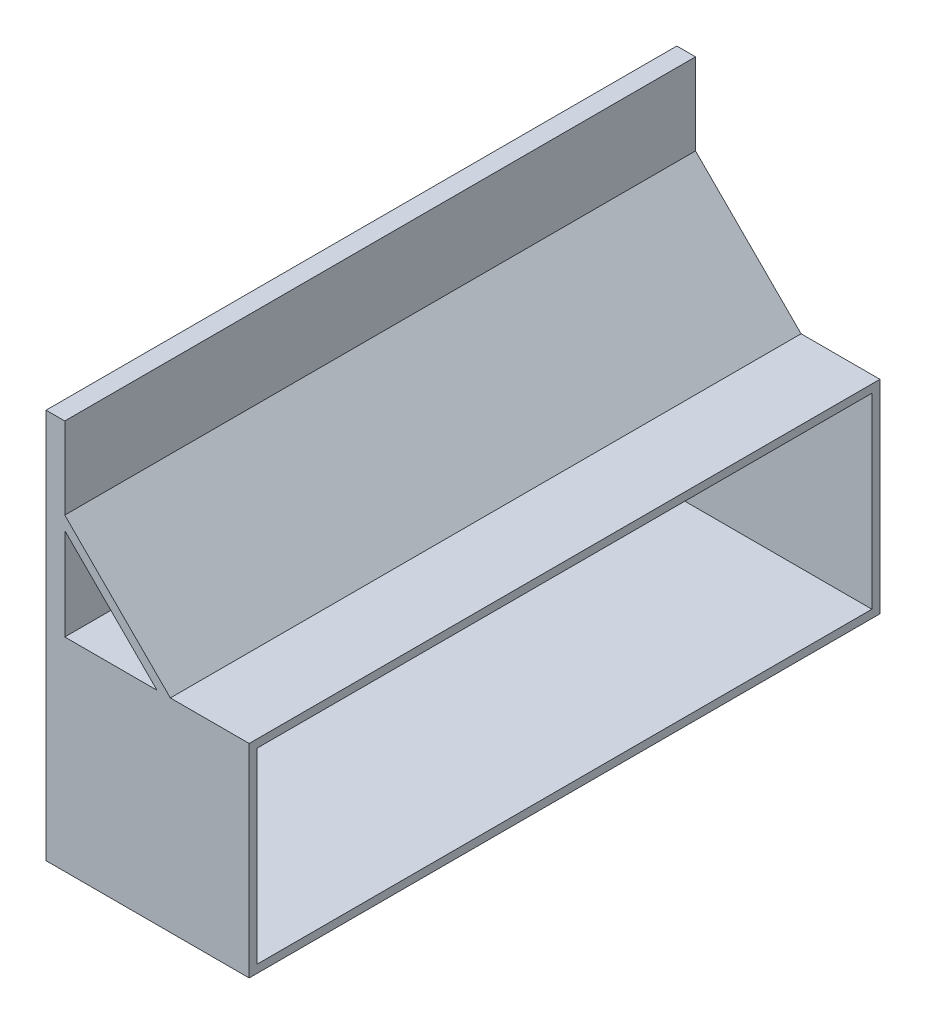
ISO-10303-21;
HEADER;
FILE_DESCRIPTION(('STEP AP214'),'2;1');
FILE_NAME('part.step','',(''),(''),'','','');
FILE_SCHEMA(('AUTOMOTIVE_DESIGN { 1 0 10303 214 1 1 1 1 }'));
ENDSEC;
DATA;
#1=APPLICATION_CONTEXT('core data for automotive mechanical design processes');
#2=APPLICATION_PROTOCOL_DEFINITION('international standard','automotive_design',2000,#1);
#3=PRODUCT_CONTEXT('',#1,'mechanical');
#4=PRODUCT('Part','Part','',(#3));
#5=PRODUCT_RELATED_PRODUCT_CATEGORY('part','',(#4));
#6=PRODUCT_DEFINITION_FORMATION('','',#4);
#7=PRODUCT_DEFINITION_CONTEXT('part definition',#1,'design');
#8=PRODUCT_DEFINITION('design','',#6,#7);
#9=PRODUCT_DEFINITION_SHAPE('','',#8);
#10=(LENGTH_UNIT() NAMED_UNIT(*) SI_UNIT(.MILLI.,.METRE.));
#11=(NAMED_UNIT(*) PLANE_ANGLE_UNIT() SI_UNIT($,.RADIAN.));
#12=(NAMED_UNIT(*) SI_UNIT($,.STERADIAN.) SOLID_ANGLE_UNIT());
#13=UNCERTAINTY_MEASURE_WITH_UNIT(LENGTH_MEASURE(1.E-05),#10,'distance_accuracy_value','');
#14=(GEOMETRIC_REPRESENTATION_CONTEXT(3) GLOBAL_UNCERTAINTY_ASSIGNED_CONTEXT((#13)) GLOBAL_UNIT_ASSIGNED_CONTEXT((#10,
#11,#12)) REPRESENTATION_CONTEXT('',''));
#15=CARTESIAN_POINT('',(0.,0.,0.));
#16=DIRECTION('',(0.,0.,1.));
#17=DIRECTION('',(1.,0.,0.));
#18=AXIS2_PLACEMENT_3D('',#15,#16,#17);
#19=CARTESIAN_POINT('',(-46.8916083916084,29.1083916083916,236.));
#20=DIRECTION('',(0.,-1.,0.));
#21=DIRECTION('',(0.,0.,-1.));
#22=AXIS2_PLACEMENT_3D('',#19,#20,#21);
#23=PLANE('',#22);
#24=DIRECTION('',(-1.,0.,0.));
#25=VECTOR('',#24,1.);
#26=CARTESIAN_POINT('',(-46.8916083916084,29.1083916083916,0.));
#27=LINE('',#26,#25);
#28=CARTESIAN_POINT('',(29.1083916083916,29.1083916083916,0.));
#29=VERTEX_POINT('',#28);
#30=CARTESIAN_POINT('',(-0.391608391608358,29.1083916083916,0.));
#31=VERTEX_POINT('',#30);
#32=EDGE_CURVE('E145',#29,#31,#27,.T.);
#33=ORIENTED_EDGE('',*,*,#32,.T.);
#34=DIRECTION('',(0.,0.,1.));
#35=VECTOR('',#34,1.);
#36=CARTESIAN_POINT('',(-0.391608391608357,29.1083916083916,0.));
#37=LINE('',#36,#35);
#38=CARTESIAN_POINT('',(-0.391608391608358,29.1083916083916,236.));
#39=VERTEX_POINT('',#38);
#40=EDGE_CURVE('E60',#31,#39,#37,.T.);
#41=ORIENTED_EDGE('',*,*,#40,.T.);
#42=DIRECTION('',(-1.,0.,0.));
#43=VECTOR('',#42,1.);
#44=CARTESIAN_POINT('',(-46.8916083916084,29.1083916083916,236.));
#45=LINE('',#44,#43);
#46=CARTESIAN_POINT('',(29.1083916083916,29.1083916083916,236.));
#47=VERTEX_POINT('',#46);
#48=EDGE_CURVE('E220',#47,#39,#45,.T.);
#49=ORIENTED_EDGE('',*,*,#48,.F.);
#50=DIRECTION('',(0.,0.,-1.));
#51=VECTOR('',#50,1.);
#52=CARTESIAN_POINT('',(29.1083916083916,29.1083916083916,236.));
#53=LINE('',#52,#51);
#54=EDGE_CURVE('E222',#47,#29,#53,.T.);
#55=ORIENTED_EDGE('',*,*,#54,.T.);
#56=EDGE_LOOP('',(#33,#41,#49,#55));
#57=FACE_BOUND('',#56,.T.);
#58=ADVANCED_FACE('F37',(#57),#23,.F.);
#59=CARTESIAN_POINT('',(-39.8916083916084,99.1083916083916,0.));
#60=DIRECTION('',(-1.,0.,0.));
#61=DIRECTION('',(0.,0.,1.));
#62=AXIS2_PLACEMENT_3D('',#59,#60,#61);
#63=PLANE('',#62);
#64=DIRECTION('',(0.,-1.,0.));
#65=VECTOR('',#64,1.);
#66=CARTESIAN_POINT('',(-39.8916083916083,99.1083916083916,236.));
#67=LINE('',#66,#65);
#68=CARTESIAN_POINT('',(-39.8916083916083,99.1083916083916,236.));
#69=VERTEX_POINT('',#68);
#70=CARTESIAN_POINT('',(-39.8916083916083,68.6083916083916,236.));
#71=VERTEX_POINT('',#70);
#72=EDGE_CURVE('E189',#69,#71,#67,.T.);
#73=ORIENTED_EDGE('',*,*,#72,.T.);
#74=DIRECTION('',(0.,0.,1.));
#75=VECTOR('',#74,1.);
#76=CARTESIAN_POINT('',(-39.8916083916083,68.6083916083916,0.));
#77=LINE('',#76,#75);
#78=CARTESIAN_POINT('',(-39.8916083916084,68.6083916083916,0.));
#79=VERTEX_POINT('',#78);
#80=EDGE_CURVE('E168',#79,#71,#77,.T.);
#81=ORIENTED_EDGE('',*,*,#80,.F.);
#82=DIRECTION('',(0.,-1.,0.));
#83=VECTOR('',#82,1.);
#84=CARTESIAN_POINT('',(-39.8916083916084,99.1083916083916,0.));
#85=LINE('',#84,#83);
#86=CARTESIAN_POINT('',(-39.8916083916084,99.1083916083916,0.));
#87=VERTEX_POINT('',#86);
#88=EDGE_CURVE('E185',#87,#79,#85,.T.);
#89=ORIENTED_EDGE('',*,*,#88,.F.);
#90=DIRECTION('',(0.,0.,-1.));
#91=VECTOR('',#90,1.);
#92=CARTESIAN_POINT('',(-39.8916083916084,99.1083916083916,0.));
#93=LINE('',#92,#91);
#94=EDGE_CURVE('E179',#69,#87,#93,.T.);
#95=ORIENTED_EDGE('',*,*,#94,.F.);
#96=EDGE_LOOP('',(#73,#81,#89,#95));
#97=FACE_BOUND('',#96,.T.);
#98=ADVANCED_FACE('F271',(#97),#63,.F.);
#99=CARTESIAN_POINT('',(-5.39160839160837,29.1083916083916,236.));
#100=VERTEX_POINT('',#99);
#101=CARTESIAN_POINT('',(-39.8916083916084,29.1083916083916,236.));
#102=VERTEX_POINT('',#101);
#103=EDGE_CURVE('E52',#100,#102,#45,.T.);
#104=ORIENTED_EDGE('',*,*,#103,.F.);
#105=DIRECTION('',(0.,0.,1.));
#106=VECTOR('',#105,1.);
#107=CARTESIAN_POINT('',(-5.39160839160836,29.1083916083916,0.));
#108=LINE('',#107,#106);
#109=CARTESIAN_POINT('',(-5.39160839160836,29.1083916083916,0.));
#110=VERTEX_POINT('',#109);
#111=EDGE_CURVE('E148',#110,#100,#108,.T.);
#112=ORIENTED_EDGE('',*,*,#111,.F.);
#113=CARTESIAN_POINT('',(-39.8916083916084,29.1083916083916,0.));
#114=VERTEX_POINT('',#113);
#115=EDGE_CURVE('E139',#110,#114,#27,.T.);
#116=ORIENTED_EDGE('',*,*,#115,.T.);
#117=DIRECTION('',(0.,0.,-1.));
#118=VECTOR('',#117,1.);
#119=CARTESIAN_POINT('',(-39.8916083916084,29.1083916083916,0.));
#120=LINE('',#119,#118);
#121=EDGE_CURVE('E171',#102,#114,#120,.T.);
#122=ORIENTED_EDGE('',*,*,#121,.F.);
#123=EDGE_LOOP('',(#104,#112,#116,#122));
#124=FACE_BOUND('',#123,.T.);
#125=ADVANCED_FACE('F149',(#124),#23,.F.);
#126=CARTESIAN_POINT('',(-46.8916083916084,29.1083916083916,236.));
#127=DIRECTION('',(1.,0.,0.));
#128=DIRECTION('',(0.,0.,-1.));
#129=AXIS2_PLACEMENT_3D('',#126,#127,#128);
#130=PLANE('',#129);
#131=DIRECTION('',(0.,-1.,0.));
#132=VECTOR('',#131,1.);
#133=CARTESIAN_POINT('',(-46.8916083916084,29.1083916083916,0.));
#134=LINE('',#133,#132);
#135=CARTESIAN_POINT('',(-46.8916083916084,99.1083916083916,0.));
#136=VERTEX_POINT('',#135);
#137=CARTESIAN_POINT('',(-46.8916083916084,-46.8916083916084,0.));
#138=VERTEX_POINT('',#137);
#139=EDGE_CURVE('E212',#136,#138,#134,.T.);
#140=ORIENTED_EDGE('',*,*,#139,.T.);
#141=DIRECTION('',(0.,0.,-1.));
#142=VECTOR('',#141,1.);
#143=CARTESIAN_POINT('',(-46.8916083916084,-46.8916083916084,236.));
#144=LINE('',#143,#142);
#145=CARTESIAN_POINT('',(-46.8916083916084,-46.8916083916084,236.));
#146=VERTEX_POINT('',#145);
#147=EDGE_CURVE('E233',#146,#138,#144,.T.);
#148=ORIENTED_EDGE('',*,*,#147,.F.);
#149=DIRECTION('',(0.,-1.,0.));
#150=VECTOR('',#149,1.);
#151=CARTESIAN_POINT('',(-46.8916083916084,29.1083916083916,236.));
#152=LINE('',#151,#150);
#153=CARTESIAN_POINT('',(-46.8916083916084,99.1083916083916,236.));
#154=VERTEX_POINT('',#153);
#155=EDGE_CURVE('E213',#154,#146,#152,.T.);
#156=ORIENTED_EDGE('',*,*,#155,.F.);
#157=DIRECTION('',(0.,0.,1.));
#158=VECTOR('',#157,1.);
#159=CARTESIAN_POINT('',(-46.8916083916084,99.1083916083916,0.));
#160=LINE('',#159,#158);
#161=EDGE_CURVE('E174',#136,#154,#160,.T.);
#162=ORIENTED_EDGE('',*,*,#161,.F.);
#163=EDGE_LOOP('',(#140,#148,#156,#162));
#164=FACE_BOUND('',#163,.T.);
#165=DIRECTION('',(0.,0.,-1.));
#166=VECTOR('',#165,1.);
#167=CARTESIAN_POINT('',(-46.8916083916084,-43.8916083916084,233.));
#168=LINE('',#167,#166);
#169=CARTESIAN_POINT('',(-46.8916083916084,-43.8916083916084,233.));
#170=VERTEX_POINT('',#169);
#171=CARTESIAN_POINT('',(-46.8916083916084,-43.8916083916084,3.00000000000001));
#172=VERTEX_POINT('',#171);
#173=EDGE_CURVE('E191',#170,#172,#168,.T.);
#174=ORIENTED_EDGE('',*,*,#173,.T.);
#175=DIRECTION('',(0.,-1.,0.));
#176=VECTOR('',#175,1.);
#177=CARTESIAN_POINT('',(-46.8916083916084,26.1083916083916,3.));
#178=LINE('',#177,#176);
#179=CARTESIAN_POINT('',(-46.8916083916084,26.1083916083916,3.));
#180=VERTEX_POINT('',#179);
#181=EDGE_CURVE('E194',#180,#172,#178,.T.);
#182=ORIENTED_EDGE('',*,*,#181,.F.);
#183=DIRECTION('',(0.,0.,-1.));
#184=VECTOR('',#183,1.);
#185=CARTESIAN_POINT('',(-46.8916083916084,26.1083916083916,233.));
#186=LINE('',#185,#184);
#187=CARTESIAN_POINT('',(-46.8916083916084,26.1083916083916,233.));
#188=VERTEX_POINT('',#187);
#189=EDGE_CURVE('E197',#188,#180,#186,.T.);
#190=ORIENTED_EDGE('',*,*,#189,.F.);
#191=DIRECTION('',(0.,-1.,0.));
#192=VECTOR('',#191,1.);
#193=CARTESIAN_POINT('',(-46.8916083916084,26.1083916083916,233.));
#194=LINE('',#193,#192);
#195=EDGE_CURVE('E200',#188,#170,#194,.T.);
#196=ORIENTED_EDGE('',*,*,#195,.T.);
#197=EDGE_LOOP('',(#174,#182,#190,#196));
#198=FACE_BOUND('',#197,.T.);
#199=ADVANCED_FACE('F39',(#164,#198),#130,.F.);
#200=CARTESIAN_POINT('',(29.1083916083916,29.1083916083916,236.));
#201=DIRECTION('',(-1.,0.,0.));
#202=DIRECTION('',(0.,-1.,0.));
#203=AXIS2_PLACEMENT_3D('',#200,#201,#202);
#204=PLANE('',#203);
#205=DIRECTION('',(0.,1.,0.));
#206=VECTOR('',#205,1.);
#207=CARTESIAN_POINT('',(29.1083916083916,29.1083916083916,0.));
#208=LINE('',#207,#206);
#209=CARTESIAN_POINT('',(29.1083916083916,-46.8916083916084,0.));
#210=VERTEX_POINT('',#209);
#211=EDGE_CURVE('E146',#210,#29,#208,.T.);
#212=ORIENTED_EDGE('',*,*,#211,.T.);
#213=ORIENTED_EDGE('',*,*,#54,.F.);
#214=DIRECTION('',(0.,1.,0.));
#215=VECTOR('',#214,1.);
#216=CARTESIAN_POINT('',(29.1083916083916,29.1083916083916,236.));
#217=LINE('',#216,#215);
#218=CARTESIAN_POINT('',(29.1083916083916,-46.8916083916084,236.));
#219=VERTEX_POINT('',#218);
#220=EDGE_CURVE('E218',#219,#47,#217,.T.);
#221=ORIENTED_EDGE('',*,*,#220,.F.);
#222=DIRECTION('',(0.,0.,-1.));
#223=VECTOR('',#222,1.);
#224=CARTESIAN_POINT('',(29.1083916083916,-46.8916083916084,236.));
#225=LINE('',#224,#223);
#226=EDGE_CURVE('E230',#219,#210,#225,.T.);
#227=ORIENTED_EDGE('',*,*,#226,.T.);
#228=EDGE_LOOP('',(#212,#213,#221,#227));
#229=FACE_BOUND('',#228,.T.);
#230=DIRECTION('',(0.,0.,-1.));
#231=VECTOR('',#230,1.);
#232=CARTESIAN_POINT('',(29.1083916083916,-43.8916083916084,236.));
#233=LINE('',#232,#231);
#234=CARTESIAN_POINT('',(29.1083916083916,-43.8916083916084,233.));
#235=VERTEX_POINT('',#234);
#236=CARTESIAN_POINT('',(29.1083916083916,-43.8916083916084,3.00000000000001));
#237=VERTEX_POINT('',#236);
#238=EDGE_CURVE('E11',#235,#237,#233,.T.);
#239=ORIENTED_EDGE('',*,*,#238,.F.);
#240=DIRECTION('',(0.,-1.,0.));
#241=VECTOR('',#240,1.);
#242=CARTESIAN_POINT('',(29.1083916083916,29.1083916083916,233.));
#243=LINE('',#242,#241);
#244=CARTESIAN_POINT('',(29.1083916083916,26.1083916083916,233.));
#245=VERTEX_POINT('',#244);
#246=EDGE_CURVE('E236',#245,#235,#243,.T.);
#247=ORIENTED_EDGE('',*,*,#246,.F.);
#248=DIRECTION('',(0.,0.,-1.));
#249=VECTOR('',#248,1.);
#250=CARTESIAN_POINT('',(29.1083916083916,26.1083916083916,236.));
#251=LINE('',#250,#249);
#252=CARTESIAN_POINT('',(29.1083916083916,26.1083916083916,3.));
#253=VERTEX_POINT('',#252);
#254=EDGE_CURVE('E238',#245,#253,#251,.T.);
#255=ORIENTED_EDGE('',*,*,#254,.T.);
#256=DIRECTION('',(0.,-1.,0.));
#257=VECTOR('',#256,1.);
#258=CARTESIAN_POINT('',(29.1083916083916,29.1083916083916,3.));
#259=LINE('',#258,#257);
#260=EDGE_CURVE('E45',#253,#237,#259,.T.);
#261=ORIENTED_EDGE('',*,*,#260,.T.);
#262=EDGE_LOOP('',(#239,#247,#255,#261));
#263=FACE_BOUND('',#262,.T.);
#264=ADVANCED_FACE('F243',(#229,#263),#204,.F.);
#265=CARTESIAN_POINT('',(-46.8916083916084,-46.8916083916084,236.));
#266=DIRECTION('',(0.,1.,0.));
#267=DIRECTION('',(0.,0.,1.));
#268=AXIS2_PLACEMENT_3D('',#265,#266,#267);
#269=PLANE('',#268);
#270=DIRECTION('',(1.,0.,0.));
#271=VECTOR('',#270,1.);
#272=CARTESIAN_POINT('',(-46.8916083916084,-46.8916083916084,0.));
#273=LINE('',#272,#271);
#274=EDGE_CURVE('E225',#138,#210,#273,.T.);
#275=ORIENTED_EDGE('',*,*,#274,.T.);
#276=ORIENTED_EDGE('',*,*,#226,.F.);
#277=DIRECTION('',(1.,0.,0.));
#278=VECTOR('',#277,1.);
#279=CARTESIAN_POINT('',(-46.8916083916084,-46.8916083916084,236.));
#280=LINE('',#279,#278);
#281=EDGE_CURVE('E216',#146,#219,#280,.T.);
#282=ORIENTED_EDGE('',*,*,#281,.F.);
#283=ORIENTED_EDGE('',*,*,#147,.T.);
#284=EDGE_LOOP('',(#275,#276,#282,#283));
#285=FACE_BOUND('',#284,.T.);
#286=ADVANCED_FACE('F289',(#285),#269,.F.);
#287=CARTESIAN_POINT('',(0.,0.,236.));
#288=DIRECTION('',(0.,0.,1.));
#289=DIRECTION('',(1.,0.,0.));
#290=AXIS2_PLACEMENT_3D('',#287,#288,#289);
#291=PLANE('',#290);
#292=ORIENTED_EDGE('',*,*,#48,.T.);
#293=DIRECTION('',(-0.707106781186547,0.707106781186548,0.));
#294=VECTOR('',#293,1.);
#295=CARTESIAN_POINT('',(-0.391608391608357,29.1083916083916,236.));
#296=LINE('',#295,#294);
#297=EDGE_CURVE('E159',#39,#71,#296,.T.);
#298=ORIENTED_EDGE('',*,*,#297,.T.);
#299=ORIENTED_EDGE('',*,*,#72,.F.);
#300=DIRECTION('',(1.,0.,0.));
#301=VECTOR('',#300,1.);
#302=CARTESIAN_POINT('',(-46.8916083916084,99.1083916083916,236.));
#303=LINE('',#302,#301);
#304=EDGE_CURVE('E177',#154,#69,#303,.T.);
#305=ORIENTED_EDGE('',*,*,#304,.F.);
#306=ORIENTED_EDGE('',*,*,#155,.T.);
#307=ORIENTED_EDGE('',*,*,#281,.T.);
#308=ORIENTED_EDGE('',*,*,#220,.T.);
#309=EDGE_LOOP('',(#292,#298,#299,#305,#306,#307,#308));
#310=FACE_BOUND('',#309,.T.);
#311=DIRECTION('',(0.707106781186547,-0.707106781186548,0.));
#312=VECTOR('',#311,1.);
#313=CARTESIAN_POINT('',(-39.8916083916083,63.6083916083916,236.));
#314=LINE('',#313,#312);
#315=CARTESIAN_POINT('',(-39.8916083916083,63.6083916083916,236.));
#316=VERTEX_POINT('',#315);
#317=EDGE_CURVE('E164',#316,#100,#314,.T.);
#318=ORIENTED_EDGE('',*,*,#317,.T.);
#319=ORIENTED_EDGE('',*,*,#103,.T.);
#320=EDGE_CURVE('E188',#316,#102,#67,.T.);
#321=ORIENTED_EDGE('',*,*,#320,.F.);
#322=EDGE_LOOP('',(#318,#319,#321));
#323=FACE_BOUND('',#322,.T.);
#324=ADVANCED_FACE('F307',(#310,#323),#291,.T.);
#325=CARTESIAN_POINT('',(0.,0.,0.));
#326=DIRECTION('',(0.,0.,1.));
#327=DIRECTION('',(1.,0.,0.));
#328=AXIS2_PLACEMENT_3D('',#325,#326,#327);
#329=PLANE('',#328);
#330=DIRECTION('',(-0.707106781186547,0.707106781186548,0.));
#331=VECTOR('',#330,1.);
#332=CARTESIAN_POINT('',(-0.391608391608357,29.1083916083916,0.));
#333=LINE('',#332,#331);
#334=EDGE_CURVE('E158',#31,#79,#333,.T.);
#335=ORIENTED_EDGE('',*,*,#334,.F.);
#336=ORIENTED_EDGE('',*,*,#32,.F.);
#337=ORIENTED_EDGE('',*,*,#211,.F.);
#338=ORIENTED_EDGE('',*,*,#274,.F.);
#339=ORIENTED_EDGE('',*,*,#139,.F.);
#340=DIRECTION('',(-1.,0.,0.));
#341=VECTOR('',#340,1.);
#342=CARTESIAN_POINT('',(-46.8916083916084,99.1083916083916,0.));
#343=LINE('',#342,#341);
#344=EDGE_CURVE('E181',#87,#136,#343,.T.);
#345=ORIENTED_EDGE('',*,*,#344,.F.);
#346=ORIENTED_EDGE('',*,*,#88,.T.);
#347=EDGE_LOOP('',(#335,#336,#337,#338,#339,#345,#346));
#348=FACE_BOUND('',#347,.T.);
#349=ORIENTED_EDGE('',*,*,#115,.F.);
#350=DIRECTION('',(0.707106781186547,-0.707106781186548,0.));
#351=VECTOR('',#350,1.);
#352=CARTESIAN_POINT('',(-39.8916083916083,63.6083916083916,0.));
#353=LINE('',#352,#351);
#354=CARTESIAN_POINT('',(-39.8916083916084,63.6083916083916,0.));
#355=VERTEX_POINT('',#354);
#356=EDGE_CURVE('E142',#355,#110,#353,.T.);
#357=ORIENTED_EDGE('',*,*,#356,.F.);
#358=EDGE_CURVE('E143',#355,#114,#85,.T.);
#359=ORIENTED_EDGE('',*,*,#358,.T.);
#360=EDGE_LOOP('',(#349,#357,#359));
#361=FACE_BOUND('',#360,.T.);
#362=ADVANCED_FACE('F140',(#348,#361),#329,.F.);
#363=CARTESIAN_POINT('',(83.1941473452421,-43.8916083916084,233.));
#364=DIRECTION('',(0.,1.,0.));
#365=DIRECTION('',(0.,0.,1.));
#366=AXIS2_PLACEMENT_3D('',#363,#364,#365);
#367=PLANE('',#366);
#368=ORIENTED_EDGE('',*,*,#238,.T.);
#369=DIRECTION('',(-1.,0.,0.));
#370=VECTOR('',#369,1.);
#371=CARTESIAN_POINT('',(83.1941473452421,-43.8916083916084,3.00000000000001));
#372=LINE('',#371,#370);
#373=EDGE_CURVE('E210',#237,#172,#372,.T.);
#374=ORIENTED_EDGE('',*,*,#373,.T.);
#375=ORIENTED_EDGE('',*,*,#173,.F.);
#376=DIRECTION('',(-1.,0.,0.));
#377=VECTOR('',#376,1.);
#378=CARTESIAN_POINT('',(83.1941473452421,-43.8916083916084,233.));
#379=LINE('',#378,#377);
#380=EDGE_CURVE('E203',#235,#170,#379,.T.);
#381=ORIENTED_EDGE('',*,*,#380,.F.);
#382=EDGE_LOOP('',(#368,#374,#375,#381));
#383=FACE_BOUND('',#382,.T.);
#384=ADVANCED_FACE('F258',(#383),#367,.T.);
#385=CARTESIAN_POINT('',(83.1941473452421,26.1083916083916,3.));
#386=DIRECTION('',(0.,0.,-1.));
#387=DIRECTION('',(0.,1.,0.));
#388=AXIS2_PLACEMENT_3D('',#385,#386,#387);
#389=PLANE('',#388);
#390=DIRECTION('',(-1.,0.,0.));
#391=VECTOR('',#390,1.);
#392=CARTESIAN_POINT('',(83.1941473452421,26.1083916083916,3.));
#393=LINE('',#392,#391);
#394=EDGE_CURVE('E208',#253,#180,#393,.T.);
#395=ORIENTED_EDGE('',*,*,#394,.T.);
#396=ORIENTED_EDGE('',*,*,#181,.T.);
#397=ORIENTED_EDGE('',*,*,#373,.F.);
#398=ORIENTED_EDGE('',*,*,#260,.F.);
#399=EDGE_LOOP('',(#395,#396,#397,#398));
#400=FACE_BOUND('',#399,.T.);
#401=ADVANCED_FACE('F249',(#400),#389,.F.);
#402=CARTESIAN_POINT('',(83.1941473452421,26.1083916083916,233.));
#403=DIRECTION('',(0.,1.,0.));
#404=DIRECTION('',(0.,0.,1.));
#405=AXIS2_PLACEMENT_3D('',#402,#403,#404);
#406=PLANE('',#405);
#407=DIRECTION('',(-1.,0.,0.));
#408=VECTOR('',#407,1.);
#409=CARTESIAN_POINT('',(83.1941473452421,26.1083916083916,233.));
#410=LINE('',#409,#408);
#411=EDGE_CURVE('E206',#245,#188,#410,.T.);
#412=ORIENTED_EDGE('',*,*,#411,.T.);
#413=ORIENTED_EDGE('',*,*,#189,.T.);
#414=ORIENTED_EDGE('',*,*,#394,.F.);
#415=ORIENTED_EDGE('',*,*,#254,.F.);
#416=EDGE_LOOP('',(#412,#413,#414,#415));
#417=FACE_BOUND('',#416,.T.);
#418=ADVANCED_FACE('F251',(#417),#406,.F.);
#419=CARTESIAN_POINT('',(83.1941473452421,26.1083916083916,233.));
#420=DIRECTION('',(0.,0.,-1.));
#421=DIRECTION('',(-1.,0.,0.));
#422=AXIS2_PLACEMENT_3D('',#419,#420,#421);
#423=PLANE('',#422);
#424=ORIENTED_EDGE('',*,*,#246,.T.);
#425=ORIENTED_EDGE('',*,*,#380,.T.);
#426=ORIENTED_EDGE('',*,*,#195,.F.);
#427=ORIENTED_EDGE('',*,*,#411,.F.);
#428=EDGE_LOOP('',(#424,#425,#426,#427));
#429=FACE_BOUND('',#428,.T.);
#430=ADVANCED_FACE('F260',(#429),#423,.T.);
#431=ORIENTED_EDGE('',*,*,#358,.F.);
#432=DIRECTION('',(0.,0.,1.));
#433=VECTOR('',#432,1.);
#434=CARTESIAN_POINT('',(-39.8916083916083,63.6083916083916,0.));
#435=LINE('',#434,#433);
#436=EDGE_CURVE('E153',#355,#316,#435,.T.);
#437=ORIENTED_EDGE('',*,*,#436,.T.);
#438=ORIENTED_EDGE('',*,*,#320,.T.);
#439=ORIENTED_EDGE('',*,*,#121,.T.);
#440=EDGE_LOOP('',(#431,#437,#438,#439));
#441=FACE_BOUND('',#440,.T.);
#442=ADVANCED_FACE('F262',(#441),#63,.F.);
#443=CARTESIAN_POINT('',(0.,99.1083916083916,0.));
#444=DIRECTION('',(0.,1.,0.));
#445=DIRECTION('',(0.,0.,1.));
#446=AXIS2_PLACEMENT_3D('',#443,#444,#445);
#447=PLANE('',#446);
#448=ORIENTED_EDGE('',*,*,#161,.T.);
#449=ORIENTED_EDGE('',*,*,#304,.T.);
#450=ORIENTED_EDGE('',*,*,#94,.T.);
#451=ORIENTED_EDGE('',*,*,#344,.T.);
#452=EDGE_LOOP('',(#448,#449,#450,#451));
#453=FACE_BOUND('',#452,.T.);
#454=ADVANCED_FACE('F268',(#453),#447,.T.);
#455=CARTESIAN_POINT('',(-0.391608391608357,29.1083916083916,0.));
#456=DIRECTION('',(0.707106781186548,0.707106781186547,0.));
#457=DIRECTION('',(-0.707106781186547,0.707106781186548,0.));
#458=AXIS2_PLACEMENT_3D('',#455,#456,#457);
#459=PLANE('',#458);
#460=ORIENTED_EDGE('',*,*,#297,.F.);
#461=ORIENTED_EDGE('',*,*,#40,.F.);
#462=ORIENTED_EDGE('',*,*,#334,.T.);
#463=ORIENTED_EDGE('',*,*,#80,.T.);
#464=EDGE_LOOP('',(#460,#461,#462,#463));
#465=FACE_BOUND('',#464,.T.);
#466=ADVANCED_FACE('F305',(#465),#459,.T.);
#467=CARTESIAN_POINT('',(-39.8916083916083,63.6083916083916,0.));
#468=DIRECTION('',(-0.707106781186548,-0.707106781186547,0.));
#469=DIRECTION('',(0.707106781186547,-0.707106781186548,0.));
#470=AXIS2_PLACEMENT_3D('',#467,#468,#469);
#471=PLANE('',#470);
#472=ORIENTED_EDGE('',*,*,#317,.F.);
#473=ORIENTED_EDGE('',*,*,#436,.F.);
#474=ORIENTED_EDGE('',*,*,#356,.T.);
#475=ORIENTED_EDGE('',*,*,#111,.T.);
#476=EDGE_LOOP('',(#472,#473,#474,#475));
#477=FACE_BOUND('',#476,.T.);
#478=ADVANCED_FACE('F156',(#477),#471,.T.);
#479=CLOSED_SHELL('',(#58,#98,#125,#199,#264,#286,#324,#362,#384,#401,#418,#430,#442,#454,#466,#478));
#480=MANIFOLD_SOLID_BREP('B2',#479);
#481=ADVANCED_BREP_SHAPE_REPRESENTATION('',(#18,#480),#14);
#482=SHAPE_DEFINITION_REPRESENTATION(#9,#481);
ENDSEC;
END-ISO-10303-21;
